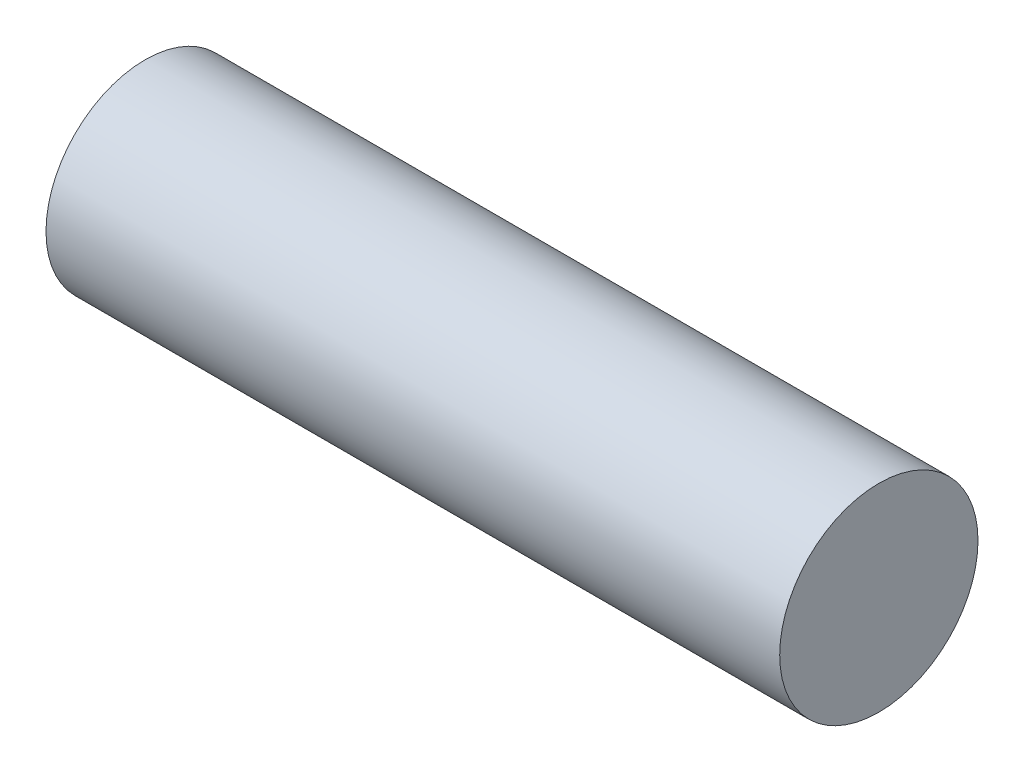
ISO-10303-21;
HEADER;
FILE_DESCRIPTION(('STEP AP214'),'2;1');
FILE_NAME('part.step','',(''),(''),'','','');
FILE_SCHEMA(('AUTOMOTIVE_DESIGN { 1 0 10303 214 1 1 1 1 }'));
ENDSEC;
DATA;
#1=APPLICATION_CONTEXT('core data for automotive mechanical design processes');
#2=APPLICATION_PROTOCOL_DEFINITION('international standard','automotive_design',2000,#1);
#3=PRODUCT_CONTEXT('',#1,'mechanical');
#4=PRODUCT('Part','Part','',(#3));
#5=PRODUCT_RELATED_PRODUCT_CATEGORY('part','',(#4));
#6=PRODUCT_DEFINITION_FORMATION('','',#4);
#7=PRODUCT_DEFINITION_CONTEXT('part definition',#1,'design');
#8=PRODUCT_DEFINITION('design','',#6,#7);
#9=PRODUCT_DEFINITION_SHAPE('','',#8);
#10=(LENGTH_UNIT() NAMED_UNIT(*) SI_UNIT(.MILLI.,.METRE.));
#11=(NAMED_UNIT(*) PLANE_ANGLE_UNIT() SI_UNIT($,.RADIAN.));
#12=(NAMED_UNIT(*) SI_UNIT($,.STERADIAN.) SOLID_ANGLE_UNIT());
#13=UNCERTAINTY_MEASURE_WITH_UNIT(LENGTH_MEASURE(1.E-05),#10,'distance_accuracy_value','');
#14=(GEOMETRIC_REPRESENTATION_CONTEXT(3) GLOBAL_UNCERTAINTY_ASSIGNED_CONTEXT((#13)) GLOBAL_UNIT_ASSIGNED_CONTEXT((#10,
#11,#12)) REPRESENTATION_CONTEXT('',''));
#15=CARTESIAN_POINT('',(0.,0.,0.));
#16=DIRECTION('',(0.,0.,1.));
#17=DIRECTION('',(1.,0.,0.));
#18=AXIS2_PLACEMENT_3D('',#15,#16,#17);
#19=CARTESIAN_POINT('',(18.5,0.,0.));
#20=DIRECTION('',(-1.,0.,0.));
#21=DIRECTION('',(0.,0.,1.));
#22=AXIS2_PLACEMENT_3D('',#19,#20,#21);
#23=CYLINDRICAL_SURFACE('',#22,5.);
#24=CARTESIAN_POINT('',(18.5,0.,0.));
#25=DIRECTION('',(1.,0.,0.));
#26=DIRECTION('',(0.,0.,-1.));
#27=AXIS2_PLACEMENT_3D('',#24,#25,#26);
#28=CIRCLE('',#27,5.);
#29=CARTESIAN_POINT('',(18.5,0.,-5.));
#30=VERTEX_POINT('',#29);
#31=EDGE_CURVE('E10',#30,#30,#28,.T.);
#32=ORIENTED_EDGE('',*,*,#31,.F.);
#33=EDGE_LOOP('',(#32));
#34=FACE_BOUND('',#33,.T.);
#35=CARTESIAN_POINT('',(-18.5,0.,0.));
#36=DIRECTION('',(1.,0.,0.));
#37=DIRECTION('',(0.,0.,-1.));
#38=AXIS2_PLACEMENT_3D('',#35,#36,#37);
#39=CIRCLE('',#38,5.);
#40=CARTESIAN_POINT('',(-18.5,0.,-5.));
#41=VERTEX_POINT('',#40);
#42=EDGE_CURVE('E40',#41,#41,#39,.T.);
#43=ORIENTED_EDGE('',*,*,#42,.T.);
#44=EDGE_LOOP('',(#43));
#45=FACE_BOUND('',#44,.T.);
#46=ADVANCED_FACE('F37',(#34,#45),#23,.T.);
#47=CARTESIAN_POINT('',(18.5,0.,0.));
#48=DIRECTION('',(1.,0.,0.));
#49=DIRECTION('',(0.,0.,-1.));
#50=AXIS2_PLACEMENT_3D('',#47,#48,#49);
#51=PLANE('',#50);
#52=ORIENTED_EDGE('',*,*,#31,.T.);
#53=EDGE_LOOP('',(#52));
#54=FACE_BOUND('',#53,.T.);
#55=ADVANCED_FACE('F54',(#54),#51,.T.);
#56=CARTESIAN_POINT('',(-18.5,0.,0.));
#57=DIRECTION('',(1.,0.,0.));
#58=DIRECTION('',(0.,0.,-1.));
#59=AXIS2_PLACEMENT_3D('',#56,#57,#58);
#60=PLANE('',#59);
#61=ORIENTED_EDGE('',*,*,#42,.F.);
#62=EDGE_LOOP('',(#61));
#63=FACE_BOUND('',#62,.T.);
#64=ADVANCED_FACE('F52',(#63),#60,.F.);
#65=CLOSED_SHELL('',(#46,#55,#64));
#66=MANIFOLD_SOLID_BREP('B2',#65);
#67=ADVANCED_BREP_SHAPE_REPRESENTATION('',(#18,#66),#14);
#68=SHAPE_DEFINITION_REPRESENTATION(#9,#67);
ENDSEC;
END-ISO-10303-21;
